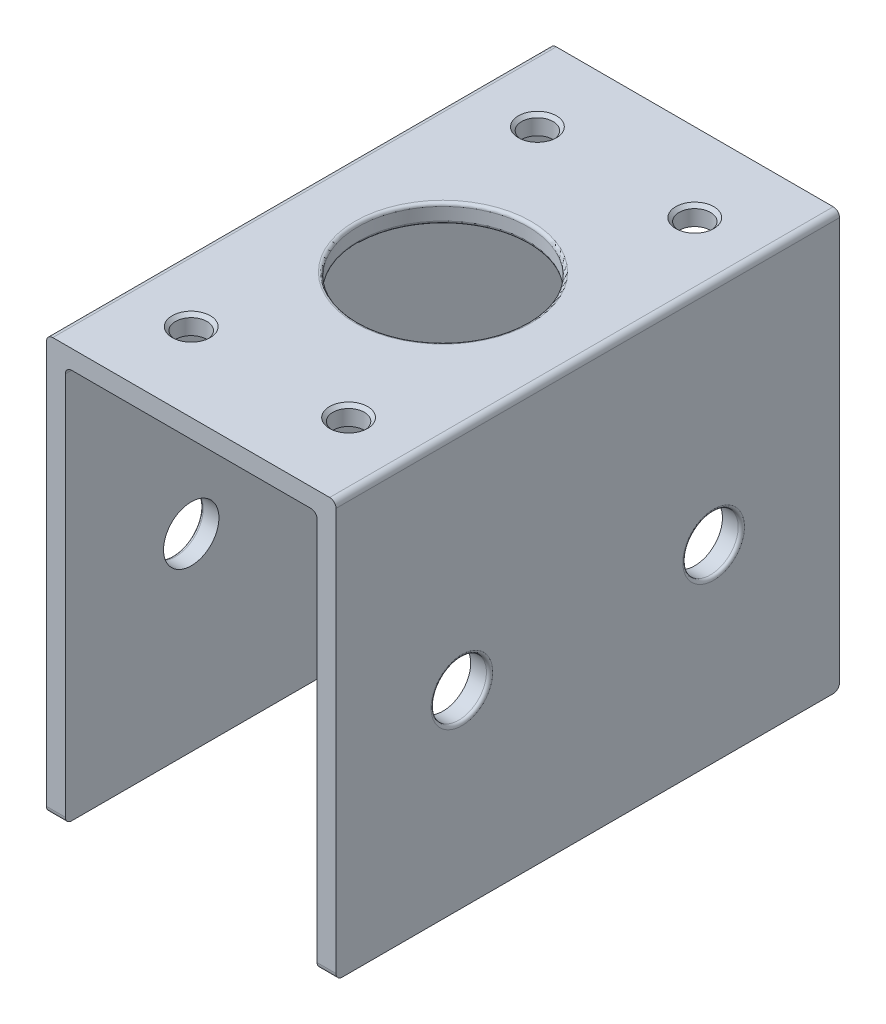
ISO-10303-21;
HEADER;
FILE_DESCRIPTION(('STEP AP214'),'2;1');
FILE_NAME('part.step','',(''),(''),'','','');
FILE_SCHEMA(('AUTOMOTIVE_DESIGN { 1 0 10303 214 1 1 1 1 }'));
ENDSEC;
DATA;
#1=APPLICATION_CONTEXT('core data for automotive mechanical design processes');
#2=APPLICATION_PROTOCOL_DEFINITION('international standard','automotive_design',2000,#1);
#3=PRODUCT_CONTEXT('',#1,'mechanical');
#4=PRODUCT('Part','Part','',(#3));
#5=PRODUCT_RELATED_PRODUCT_CATEGORY('part','',(#4));
#6=PRODUCT_DEFINITION_FORMATION('','',#4);
#7=PRODUCT_DEFINITION_CONTEXT('part definition',#1,'design');
#8=PRODUCT_DEFINITION('design','',#6,#7);
#9=PRODUCT_DEFINITION_SHAPE('','',#8);
#10=(LENGTH_UNIT() NAMED_UNIT(*) SI_UNIT(.MILLI.,.METRE.));
#11=(NAMED_UNIT(*) PLANE_ANGLE_UNIT() SI_UNIT($,.RADIAN.));
#12=(NAMED_UNIT(*) SI_UNIT($,.STERADIAN.) SOLID_ANGLE_UNIT());
#13=UNCERTAINTY_MEASURE_WITH_UNIT(LENGTH_MEASURE(1.E-05),#10,'distance_accuracy_value','');
#14=(GEOMETRIC_REPRESENTATION_CONTEXT(3) GLOBAL_UNCERTAINTY_ASSIGNED_CONTEXT((#13)) GLOBAL_UNIT_ASSIGNED_CONTEXT((#10,
#11,#12)) REPRESENTATION_CONTEXT('',''));
#15=CARTESIAN_POINT('',(0.,0.,0.));
#16=DIRECTION('',(0.,0.,1.));
#17=DIRECTION('',(1.,0.,0.));
#18=AXIS2_PLACEMENT_3D('',#15,#16,#17);
#19=CARTESIAN_POINT('',(0.,-63.,80.));
#20=DIRECTION('',(-1.,0.,0.));
#21=DIRECTION('',(0.,0.,1.));
#22=AXIS2_PLACEMENT_3D('',#19,#20,#21);
#23=PLANE('',#22);
#24=CARTESIAN_POINT('',(0.,-32.9999999999999,20.));
#25=DIRECTION('',(-1.,0.,0.));
#26=DIRECTION('',(0.,0.,1.));
#27=AXIS2_PLACEMENT_3D('',#24,#25,#26);
#28=CIRCLE('',#27,4.4);
#29=CARTESIAN_POINT('',(0.,-32.9999999999999,24.4));
#30=VERTEX_POINT('',#29);
#31=EDGE_CURVE('E931',#30,#30,#28,.T.);
#32=ORIENTED_EDGE('',*,*,#31,.T.);
#33=EDGE_LOOP('',(#32));
#34=FACE_BOUND('',#33,.T.);
#35=DIRECTION('',(0.,0.,-1.));
#36=VECTOR('',#35,1.);
#37=CARTESIAN_POINT('',(0.,-63.,80.));
#38=LINE('',#37,#36);
#39=CARTESIAN_POINT('',(0.,-63.,79.));
#40=VERTEX_POINT('',#39);
#41=CARTESIAN_POINT('',(0.,-63.,1.));
#42=VERTEX_POINT('',#41);
#43=EDGE_CURVE('E414',#40,#42,#38,.T.);
#44=ORIENTED_EDGE('',*,*,#43,.T.);
#45=CARTESIAN_POINT('',(0.,-62.,1.));
#46=DIRECTION('',(-1.,0.,0.));
#47=DIRECTION('',(0.,0.,1.));
#48=AXIS2_PLACEMENT_3D('',#45,#46,#47);
#49=CIRCLE('',#48,1.);
#50=CARTESIAN_POINT('',(0.,-62.,0.));
#51=VERTEX_POINT('',#50);
#52=EDGE_CURVE('E248',#42,#51,#49,.F.);
#53=ORIENTED_EDGE('',*,*,#52,.T.);
#54=DIRECTION('',(0.,1.,0.));
#55=VECTOR('',#54,1.);
#56=CARTESIAN_POINT('',(0.,-63.,0.));
#57=LINE('',#56,#55);
#58=CARTESIAN_POINT('',(0.,-1.,0.));
#59=VERTEX_POINT('',#58);
#60=EDGE_CURVE('E381',#51,#59,#57,.T.);
#61=ORIENTED_EDGE('',*,*,#60,.T.);
#62=DIRECTION('',(0.,0.,-1.));
#63=VECTOR('',#62,1.);
#64=CARTESIAN_POINT('',(0.,-1.,80.));
#65=LINE('',#64,#63);
#66=CARTESIAN_POINT('',(0.,-1.,80.));
#67=VERTEX_POINT('',#66);
#68=EDGE_CURVE('E245',#59,#67,#65,.F.);
#69=ORIENTED_EDGE('',*,*,#68,.T.);
#70=DIRECTION('',(0.,1.,0.));
#71=VECTOR('',#70,1.);
#72=CARTESIAN_POINT('',(0.,-63.,80.));
#73=LINE('',#72,#71);
#74=CARTESIAN_POINT('',(0.,-62.,80.));
#75=VERTEX_POINT('',#74);
#76=EDGE_CURVE('E405',#75,#67,#73,.T.);
#77=ORIENTED_EDGE('',*,*,#76,.F.);
#78=CARTESIAN_POINT('',(0.,-62.,79.));
#79=DIRECTION('',(-1.,0.,0.));
#80=DIRECTION('',(0.,0.,1.));
#81=AXIS2_PLACEMENT_3D('',#78,#79,#80);
#82=CIRCLE('',#81,1.);
#83=EDGE_CURVE('E242',#75,#40,#82,.F.);
#84=ORIENTED_EDGE('',*,*,#83,.T.);
#85=EDGE_LOOP('',(#44,#53,#61,#69,#77,#84));
#86=FACE_BOUND('',#85,.T.);
#87=CARTESIAN_POINT('',(0.,-32.9999999999999,60.));
#88=DIRECTION('',(-1.,0.,0.));
#89=DIRECTION('',(0.,0.,1.));
#90=AXIS2_PLACEMENT_3D('',#87,#88,#89);
#91=CIRCLE('',#90,4.4);
#92=CARTESIAN_POINT('',(0.,-32.9999999999999,64.4));
#93=VERTEX_POINT('',#92);
#94=EDGE_CURVE('E918',#93,#93,#91,.F.);
#95=ORIENTED_EDGE('',*,*,#94,.F.);
#96=EDGE_LOOP('',(#95));
#97=FACE_BOUND('',#96,.T.);
#98=ADVANCED_FACE('F55',(#34,#86,#97),#23,.F.);
#99=CARTESIAN_POINT('',(40.,0.,80.));
#100=DIRECTION('',(1.,0.,0.));
#101=DIRECTION('',(0.,1.,0.));
#102=AXIS2_PLACEMENT_3D('',#99,#100,#101);
#103=PLANE('',#102);
#104=CARTESIAN_POINT('',(40.,-32.9999999999999,20.));
#105=DIRECTION('',(1.,0.,0.));
#106=DIRECTION('',(0.,1.,0.));
#107=AXIS2_PLACEMENT_3D('',#104,#105,#106);
#108=CIRCLE('',#107,4.4);
#109=CARTESIAN_POINT('',(40.,-28.5999999999999,20.));
#110=VERTEX_POINT('',#109);
#111=EDGE_CURVE('E934',#110,#110,#108,.T.);
#112=ORIENTED_EDGE('',*,*,#111,.T.);
#113=EDGE_LOOP('',(#112));
#114=FACE_BOUND('',#113,.T.);
#115=DIRECTION('',(0.,-1.,0.));
#116=VECTOR('',#115,1.);
#117=CARTESIAN_POINT('',(40.,0.,0.));
#118=LINE('',#117,#116);
#119=CARTESIAN_POINT('',(40.,-1.,0.));
#120=VERTEX_POINT('',#119);
#121=CARTESIAN_POINT('',(40.,-62.,0.));
#122=VERTEX_POINT('',#121);
#123=EDGE_CURVE('E380',#120,#122,#118,.T.);
#124=ORIENTED_EDGE('',*,*,#123,.T.);
#125=CARTESIAN_POINT('',(40.,-62.,1.));
#126=DIRECTION('',(1.,0.,0.));
#127=DIRECTION('',(0.,1.,0.));
#128=AXIS2_PLACEMENT_3D('',#125,#126,#127);
#129=CIRCLE('',#128,1.);
#130=CARTESIAN_POINT('',(40.,-63.,1.));
#131=VERTEX_POINT('',#130);
#132=EDGE_CURVE('E232',#122,#131,#129,.F.);
#133=ORIENTED_EDGE('',*,*,#132,.T.);
#134=DIRECTION('',(0.,0.,-1.));
#135=VECTOR('',#134,1.);
#136=CARTESIAN_POINT('',(40.,-63.,80.));
#137=LINE('',#136,#135);
#138=CARTESIAN_POINT('',(40.,-63.,79.));
#139=VERTEX_POINT('',#138);
#140=EDGE_CURVE('E193',#139,#131,#137,.T.);
#141=ORIENTED_EDGE('',*,*,#140,.F.);
#142=CARTESIAN_POINT('',(40.,-62.,79.));
#143=DIRECTION('',(1.,0.,0.));
#144=DIRECTION('',(0.,1.,0.));
#145=AXIS2_PLACEMENT_3D('',#142,#143,#144);
#146=CIRCLE('',#145,1.);
#147=CARTESIAN_POINT('',(40.,-62.,80.));
#148=VERTEX_POINT('',#147);
#149=EDGE_CURVE('E198',#139,#148,#146,.F.);
#150=ORIENTED_EDGE('',*,*,#149,.T.);
#151=DIRECTION('',(0.,-1.,0.));
#152=VECTOR('',#151,1.);
#153=CARTESIAN_POINT('',(40.,0.,80.));
#154=LINE('',#153,#152);
#155=CARTESIAN_POINT('',(40.,-1.,80.));
#156=VERTEX_POINT('',#155);
#157=EDGE_CURVE('E391',#156,#148,#154,.T.);
#158=ORIENTED_EDGE('',*,*,#157,.F.);
#159=DIRECTION('',(0.,0.,-1.));
#160=VECTOR('',#159,1.);
#161=CARTESIAN_POINT('',(40.,-1.,0.));
#162=LINE('',#161,#160);
#163=EDGE_CURVE('E228',#156,#120,#162,.T.);
#164=ORIENTED_EDGE('',*,*,#163,.T.);
#165=EDGE_LOOP('',(#124,#133,#141,#150,#158,#164));
#166=FACE_BOUND('',#165,.T.);
#167=CARTESIAN_POINT('',(40.,-32.9999999999999,60.));
#168=DIRECTION('',(1.,0.,0.));
#169=DIRECTION('',(0.,1.,0.));
#170=AXIS2_PLACEMENT_3D('',#167,#168,#169);
#171=CIRCLE('',#170,4.4);
#172=CARTESIAN_POINT('',(40.,-28.5999999999999,60.));
#173=VERTEX_POINT('',#172);
#174=EDGE_CURVE('E925',#173,#173,#171,.F.);
#175=ORIENTED_EDGE('',*,*,#174,.F.);
#176=EDGE_LOOP('',(#175));
#177=FACE_BOUND('',#176,.T.);
#178=ADVANCED_FACE('F395',(#114,#166,#177),#103,.F.);
#179=CARTESIAN_POINT('',(43.,-63.,80.));
#180=DIRECTION('',(-1.,0.,0.));
#181=DIRECTION('',(0.,0.,1.));
#182=AXIS2_PLACEMENT_3D('',#179,#180,#181);
#183=PLANE('',#182);
#184=CARTESIAN_POINT('',(43.,-32.9999999999999,20.));
#185=DIRECTION('',(-1.,0.,0.));
#186=DIRECTION('',(0.,0.,1.));
#187=AXIS2_PLACEMENT_3D('',#184,#185,#186);
#188=CIRCLE('',#187,4.9);
#189=CARTESIAN_POINT('',(43.,-32.9999999999999,24.9));
#190=VERTEX_POINT('',#189);
#191=EDGE_CURVE('E306',#190,#190,#188,.T.);
#192=ORIENTED_EDGE('',*,*,#191,.T.);
#193=EDGE_LOOP('',(#192));
#194=FACE_BOUND('',#193,.T.);
#195=CARTESIAN_POINT('',(43.,-32.9999999999999,60.));
#196=DIRECTION('',(-1.,0.,0.));
#197=DIRECTION('',(0.,0.,1.));
#198=AXIS2_PLACEMENT_3D('',#195,#196,#197);
#199=CIRCLE('',#198,4.9);
#200=CARTESIAN_POINT('',(43.,-32.9999999999999,64.9));
#201=VERTEX_POINT('',#200);
#202=EDGE_CURVE('E302',#201,#201,#199,.T.);
#203=ORIENTED_EDGE('',*,*,#202,.T.);
#204=EDGE_LOOP('',(#203));
#205=FACE_BOUND('',#204,.T.);
#206=DIRECTION('',(0.,0.,-1.));
#207=VECTOR('',#206,1.);
#208=CARTESIAN_POINT('',(43.,-63.,80.));
#209=LINE('',#208,#207);
#210=CARTESIAN_POINT('',(43.,-63.,79.));
#211=VERTEX_POINT('',#210);
#212=CARTESIAN_POINT('',(43.,-63.,1.));
#213=VERTEX_POINT('',#212);
#214=EDGE_CURVE('E174',#211,#213,#209,.T.);
#215=ORIENTED_EDGE('',*,*,#214,.T.);
#216=CARTESIAN_POINT('',(43.,-62.,1.));
#217=DIRECTION('',(-1.,0.,0.));
#218=DIRECTION('',(0.,0.,1.));
#219=AXIS2_PLACEMENT_3D('',#216,#217,#218);
#220=CIRCLE('',#219,1.);
#221=CARTESIAN_POINT('',(43.,-62.,0.));
#222=VERTEX_POINT('',#221);
#223=EDGE_CURVE('E181',#213,#222,#220,.F.);
#224=ORIENTED_EDGE('',*,*,#223,.T.);
#225=DIRECTION('',(0.,1.,0.));
#226=VECTOR('',#225,1.);
#227=CARTESIAN_POINT('',(43.,-63.,0.));
#228=LINE('',#227,#226);
#229=CARTESIAN_POINT('',(43.,2.,0.));
#230=VERTEX_POINT('',#229);
#231=EDGE_CURVE('E420',#222,#230,#228,.T.);
#232=ORIENTED_EDGE('',*,*,#231,.T.);
#233=DIRECTION('',(0.,0.,-1.));
#234=VECTOR('',#233,1.);
#235=CARTESIAN_POINT('',(43.,2.,80.));
#236=LINE('',#235,#234);
#237=CARTESIAN_POINT('',(43.,2.,80.));
#238=VERTEX_POINT('',#237);
#239=EDGE_CURVE('E182',#230,#238,#236,.F.);
#240=ORIENTED_EDGE('',*,*,#239,.T.);
#241=DIRECTION('',(0.,1.,0.));
#242=VECTOR('',#241,1.);
#243=CARTESIAN_POINT('',(43.,-63.,80.));
#244=LINE('',#243,#242);
#245=CARTESIAN_POINT('',(43.,-62.,80.));
#246=VERTEX_POINT('',#245);
#247=EDGE_CURVE('E175',#246,#238,#244,.T.);
#248=ORIENTED_EDGE('',*,*,#247,.F.);
#249=CARTESIAN_POINT('',(43.,-62.,79.));
#250=DIRECTION('',(-1.,0.,0.));
#251=DIRECTION('',(0.,0.,1.));
#252=AXIS2_PLACEMENT_3D('',#249,#250,#251);
#253=CIRCLE('',#252,1.);
#254=EDGE_CURVE('E171',#246,#211,#253,.F.);
#255=ORIENTED_EDGE('',*,*,#254,.T.);
#256=EDGE_LOOP('',(#215,#224,#232,#240,#248,#255));
#257=FACE_BOUND('',#256,.T.);
#258=ADVANCED_FACE('F173',(#194,#205,#257),#183,.F.);
#259=CARTESIAN_POINT('',(-3.,2.99999999999999,80.));
#260=DIRECTION('',(1.,0.,0.));
#261=DIRECTION('',(0.,1.,0.));
#262=AXIS2_PLACEMENT_3D('',#259,#260,#261);
#263=PLANE('',#262);
#264=CARTESIAN_POINT('',(-3.,-32.9999999999999,60.));
#265=DIRECTION('',(1.,0.,0.));
#266=DIRECTION('',(0.,1.,0.));
#267=AXIS2_PLACEMENT_3D('',#264,#265,#266);
#268=CIRCLE('',#267,4.9);
#269=CARTESIAN_POINT('',(-3.,-28.0999999999999,60.));
#270=VERTEX_POINT('',#269);
#271=EDGE_CURVE('E322',#270,#270,#268,.T.);
#272=ORIENTED_EDGE('',*,*,#271,.T.);
#273=EDGE_LOOP('',(#272));
#274=FACE_BOUND('',#273,.T.);
#275=CARTESIAN_POINT('',(-3.,-32.9999999999999,20.));
#276=DIRECTION('',(1.,0.,0.));
#277=DIRECTION('',(0.,1.,0.));
#278=AXIS2_PLACEMENT_3D('',#275,#276,#277);
#279=CIRCLE('',#278,4.9);
#280=CARTESIAN_POINT('',(-3.,-28.0999999999999,20.));
#281=VERTEX_POINT('',#280);
#282=EDGE_CURVE('E318',#281,#281,#279,.T.);
#283=ORIENTED_EDGE('',*,*,#282,.T.);
#284=EDGE_LOOP('',(#283));
#285=FACE_BOUND('',#284,.T.);
#286=DIRECTION('',(0.,-1.,0.));
#287=VECTOR('',#286,1.);
#288=CARTESIAN_POINT('',(-3.,2.99999999999999,0.));
#289=LINE('',#288,#287);
#290=CARTESIAN_POINT('',(-3.,1.99999999999999,0.));
#291=VERTEX_POINT('',#290);
#292=CARTESIAN_POINT('',(-3.,-62.,0.));
#293=VERTEX_POINT('',#292);
#294=EDGE_CURVE('E427',#291,#293,#289,.T.);
#295=ORIENTED_EDGE('',*,*,#294,.T.);
#296=CARTESIAN_POINT('',(-3.,-62.,1.));
#297=DIRECTION('',(1.,0.,0.));
#298=DIRECTION('',(0.,1.,0.));
#299=AXIS2_PLACEMENT_3D('',#296,#297,#298);
#300=CIRCLE('',#299,1.);
#301=CARTESIAN_POINT('',(-3.,-63.,1.));
#302=VERTEX_POINT('',#301);
#303=EDGE_CURVE('E258',#293,#302,#300,.F.);
#304=ORIENTED_EDGE('',*,*,#303,.T.);
#305=DIRECTION('',(0.,0.,-1.));
#306=VECTOR('',#305,1.);
#307=CARTESIAN_POINT('',(-3.,-63.,80.));
#308=LINE('',#307,#306);
#309=CARTESIAN_POINT('',(-3.,-63.,79.));
#310=VERTEX_POINT('',#309);
#311=EDGE_CURVE('E194',#310,#302,#308,.T.);
#312=ORIENTED_EDGE('',*,*,#311,.F.);
#313=CARTESIAN_POINT('',(-3.,-62.,79.));
#314=DIRECTION('',(1.,0.,0.));
#315=DIRECTION('',(0.,1.,0.));
#316=AXIS2_PLACEMENT_3D('',#313,#314,#315);
#317=CIRCLE('',#316,1.);
#318=CARTESIAN_POINT('',(-3.,-62.,80.));
#319=VERTEX_POINT('',#318);
#320=EDGE_CURVE('E255',#310,#319,#317,.F.);
#321=ORIENTED_EDGE('',*,*,#320,.T.);
#322=DIRECTION('',(0.,-1.,0.));
#323=VECTOR('',#322,1.);
#324=CARTESIAN_POINT('',(-3.,2.99999999999999,80.));
#325=LINE('',#324,#323);
#326=CARTESIAN_POINT('',(-3.,1.99999999999999,80.));
#327=VERTEX_POINT('',#326);
#328=EDGE_CURVE('E411',#327,#319,#325,.T.);
#329=ORIENTED_EDGE('',*,*,#328,.F.);
#330=DIRECTION('',(0.,0.,-1.));
#331=VECTOR('',#330,1.);
#332=CARTESIAN_POINT('',(-3.,1.99999999999999,80.));
#333=LINE('',#332,#331);
#334=EDGE_CURVE('E251',#327,#291,#333,.T.);
#335=ORIENTED_EDGE('',*,*,#334,.T.);
#336=EDGE_LOOP('',(#295,#304,#312,#321,#329,#335));
#337=FACE_BOUND('',#336,.T.);
#338=ADVANCED_FACE('F354',(#274,#285,#337),#263,.F.);
#339=CARTESIAN_POINT('',(0.,0.,80.));
#340=DIRECTION('',(0.,1.,0.));
#341=DIRECTION('',(0.,0.,1.));
#342=AXIS2_PLACEMENT_3D('',#339,#340,#341);
#343=PLANE('',#342);
#344=CARTESIAN_POINT('',(20.,0.,40.));
#345=DIRECTION('',(0.,1.,0.));
#346=DIRECTION('',(0.,0.,1.));
#347=AXIS2_PLACEMENT_3D('',#344,#345,#346);
#348=CIRCLE('',#347,14.);
#349=CARTESIAN_POINT('',(20.,0.,54.));
#350=VERTEX_POINT('',#349);
#351=EDGE_CURVE('E330',#350,#350,#348,.T.);
#352=ORIENTED_EDGE('',*,*,#351,.T.);
#353=EDGE_LOOP('',(#352));
#354=FACE_BOUND('',#353,.T.);
#355=CARTESIAN_POINT('',(7.5,0.,12.5));
#356=DIRECTION('',(0.,1.,0.));
#357=DIRECTION('',(0.,0.,1.));
#358=AXIS2_PLACEMENT_3D('',#355,#356,#357);
#359=CIRCLE('',#358,2.49999999999999);
#360=CARTESIAN_POINT('',(7.5,0.,15.));
#361=VERTEX_POINT('',#360);
#362=EDGE_CURVE('E207',#361,#361,#359,.T.);
#363=ORIENTED_EDGE('',*,*,#362,.T.);
#364=EDGE_LOOP('',(#363));
#365=FACE_BOUND('',#364,.T.);
#366=CARTESIAN_POINT('',(32.5,0.,12.5));
#367=DIRECTION('',(0.,1.,0.));
#368=DIRECTION('',(0.,0.,1.));
#369=AXIS2_PLACEMENT_3D('',#366,#367,#368);
#370=CIRCLE('',#369,2.49999999999999);
#371=CARTESIAN_POINT('',(32.5,0.,15.));
#372=VERTEX_POINT('',#371);
#373=EDGE_CURVE('E362',#372,#372,#370,.T.);
#374=ORIENTED_EDGE('',*,*,#373,.T.);
#375=EDGE_LOOP('',(#374));
#376=FACE_BOUND('',#375,.T.);
#377=CARTESIAN_POINT('',(32.5,0.,67.5));
#378=DIRECTION('',(0.,1.,0.));
#379=DIRECTION('',(0.,0.,1.));
#380=AXIS2_PLACEMENT_3D('',#377,#378,#379);
#381=CIRCLE('',#380,2.49999999999999);
#382=CARTESIAN_POINT('',(32.5,0.,70.));
#383=VERTEX_POINT('',#382);
#384=EDGE_CURVE('E366',#383,#383,#381,.T.);
#385=ORIENTED_EDGE('',*,*,#384,.T.);
#386=EDGE_LOOP('',(#385));
#387=FACE_BOUND('',#386,.T.);
#388=CARTESIAN_POINT('',(7.50000000000001,0.,67.5));
#389=DIRECTION('',(0.,1.,0.));
#390=DIRECTION('',(0.,0.,1.));
#391=AXIS2_PLACEMENT_3D('',#388,#389,#390);
#392=CIRCLE('',#391,2.49999999999999);
#393=CARTESIAN_POINT('',(7.50000000000001,0.,70.));
#394=VERTEX_POINT('',#393);
#395=EDGE_CURVE('E370',#394,#394,#392,.T.);
#396=ORIENTED_EDGE('',*,*,#395,.T.);
#397=EDGE_LOOP('',(#396));
#398=FACE_BOUND('',#397,.T.);
#399=DIRECTION('',(1.,0.,0.));
#400=VECTOR('',#399,1.);
#401=CARTESIAN_POINT('',(0.,0.,0.));
#402=LINE('',#401,#400);
#403=CARTESIAN_POINT('',(1.,0.,0.));
#404=VERTEX_POINT('',#403);
#405=CARTESIAN_POINT('',(39.,0.,0.));
#406=VERTEX_POINT('',#405);
#407=EDGE_CURVE('E373',#404,#406,#402,.T.);
#408=ORIENTED_EDGE('',*,*,#407,.T.);
#409=DIRECTION('',(0.,0.,-1.));
#410=VECTOR('',#409,1.);
#411=CARTESIAN_POINT('',(39.,0.,80.));
#412=LINE('',#411,#410);
#413=CARTESIAN_POINT('',(39.,0.,80.));
#414=VERTEX_POINT('',#413);
#415=EDGE_CURVE('E265',#406,#414,#412,.F.);
#416=ORIENTED_EDGE('',*,*,#415,.T.);
#417=DIRECTION('',(1.,0.,0.));
#418=VECTOR('',#417,1.);
#419=CARTESIAN_POINT('',(0.,0.,80.));
#420=LINE('',#419,#418);
#421=CARTESIAN_POINT('',(1.,0.,80.));
#422=VERTEX_POINT('',#421);
#423=EDGE_CURVE('E392',#422,#414,#420,.T.);
#424=ORIENTED_EDGE('',*,*,#423,.F.);
#425=DIRECTION('',(0.,0.,-1.));
#426=VECTOR('',#425,1.);
#427=CARTESIAN_POINT('',(1.,0.,0.));
#428=LINE('',#427,#426);
#429=EDGE_CURVE('E261',#422,#404,#428,.T.);
#430=ORIENTED_EDGE('',*,*,#429,.T.);
#431=EDGE_LOOP('',(#408,#416,#424,#430));
#432=FACE_BOUND('',#431,.T.);
#433=ADVANCED_FACE('F351',(#354,#365,#376,#387,#398,#432),#343,.F.);
#434=CARTESIAN_POINT('',(40.,-63.,80.));
#435=DIRECTION('',(0.,1.,0.));
#436=DIRECTION('',(0.,0.,1.));
#437=AXIS2_PLACEMENT_3D('',#434,#435,#436);
#438=PLANE('',#437);
#439=ORIENTED_EDGE('',*,*,#140,.T.);
#440=DIRECTION('',(1.,0.,0.));
#441=VECTOR('',#440,1.);
#442=CARTESIAN_POINT('',(43.,-63.,1.));
#443=LINE('',#442,#441);
#444=EDGE_CURVE('E191',#131,#213,#443,.T.);
#445=ORIENTED_EDGE('',*,*,#444,.T.);
#446=ORIENTED_EDGE('',*,*,#214,.F.);
#447=DIRECTION('',(1.,0.,0.));
#448=VECTOR('',#447,1.);
#449=CARTESIAN_POINT('',(40.,-63.,79.));
#450=LINE('',#449,#448);
#451=EDGE_CURVE('E188',#211,#139,#450,.F.);
#452=ORIENTED_EDGE('',*,*,#451,.T.);
#453=EDGE_LOOP('',(#439,#445,#446,#452));
#454=FACE_BOUND('',#453,.T.);
#455=ADVANCED_FACE('F187',(#454),#438,.F.);
#456=CARTESIAN_POINT('',(43.,3.,80.));
#457=DIRECTION('',(0.,-1.,0.));
#458=DIRECTION('',(1.,0.,0.));
#459=AXIS2_PLACEMENT_3D('',#456,#457,#458);
#460=PLANE('',#459);
#461=CARTESIAN_POINT('',(20.,3.,40.));
#462=DIRECTION('',(0.,-1.,0.));
#463=DIRECTION('',(1.,0.,0.));
#464=AXIS2_PLACEMENT_3D('',#461,#462,#463);
#465=CIRCLE('',#464,14.);
#466=CARTESIAN_POINT('',(34.,3.,40.));
#467=VERTEX_POINT('',#466);
#468=EDGE_CURVE('E11',#467,#467,#465,.T.);
#469=ORIENTED_EDGE('',*,*,#468,.T.);
#470=EDGE_LOOP('',(#469));
#471=FACE_BOUND('',#470,.T.);
#472=CARTESIAN_POINT('',(7.5,3.,12.5));
#473=DIRECTION('',(0.,1.,0.));
#474=DIRECTION('',(0.,0.,1.));
#475=AXIS2_PLACEMENT_3D('',#472,#473,#474);
#476=CIRCLE('',#475,3.025);
#477=CARTESIAN_POINT('',(7.5,3.,15.525));
#478=VERTEX_POINT('',#477);
#479=EDGE_CURVE('E898',#478,#478,#476,.T.);
#480=ORIENTED_EDGE('',*,*,#479,.F.);
#481=EDGE_LOOP('',(#480));
#482=FACE_BOUND('',#481,.T.);
#483=CARTESIAN_POINT('',(32.5,3.,12.5));
#484=DIRECTION('',(0.,1.,0.));
#485=DIRECTION('',(0.,0.,1.));
#486=AXIS2_PLACEMENT_3D('',#483,#484,#485);
#487=CIRCLE('',#486,3.025);
#488=CARTESIAN_POINT('',(32.5,3.,15.525));
#489=VERTEX_POINT('',#488);
#490=EDGE_CURVE('E452',#489,#489,#487,.T.);
#491=ORIENTED_EDGE('',*,*,#490,.F.);
#492=EDGE_LOOP('',(#491));
#493=FACE_BOUND('',#492,.T.);
#494=CARTESIAN_POINT('',(32.5,3.,67.5));
#495=DIRECTION('',(0.,1.,0.));
#496=DIRECTION('',(0.,0.,1.));
#497=AXIS2_PLACEMENT_3D('',#494,#495,#496);
#498=CIRCLE('',#497,3.025);
#499=CARTESIAN_POINT('',(32.5,3.,70.525));
#500=VERTEX_POINT('',#499);
#501=EDGE_CURVE('E444',#500,#500,#498,.T.);
#502=ORIENTED_EDGE('',*,*,#501,.F.);
#503=EDGE_LOOP('',(#502));
#504=FACE_BOUND('',#503,.T.);
#505=CARTESIAN_POINT('',(7.50000000000001,3.,67.5));
#506=DIRECTION('',(0.,1.,0.));
#507=DIRECTION('',(0.,0.,1.));
#508=AXIS2_PLACEMENT_3D('',#505,#506,#507);
#509=CIRCLE('',#508,3.025);
#510=CARTESIAN_POINT('',(7.50000000000001,3.,70.525));
#511=VERTEX_POINT('',#510);
#512=EDGE_CURVE('E441',#511,#511,#509,.T.);
#513=ORIENTED_EDGE('',*,*,#512,.F.);
#514=EDGE_LOOP('',(#513));
#515=FACE_BOUND('',#514,.T.);
#516=DIRECTION('',(-1.,0.,0.));
#517=VECTOR('',#516,1.);
#518=CARTESIAN_POINT('',(43.,3.,80.));
#519=LINE('',#518,#517);
#520=CARTESIAN_POINT('',(42.,3.,80.));
#521=VERTEX_POINT('',#520);
#522=CARTESIAN_POINT('',(-2.,2.99999999999999,80.));
#523=VERTEX_POINT('',#522);
#524=EDGE_CURVE('E403',#521,#523,#519,.T.);
#525=ORIENTED_EDGE('',*,*,#524,.F.);
#526=DIRECTION('',(0.,0.,-1.));
#527=VECTOR('',#526,1.);
#528=CARTESIAN_POINT('',(42.,3.,80.));
#529=LINE('',#528,#527);
#530=CARTESIAN_POINT('',(42.,3.,0.));
#531=VERTEX_POINT('',#530);
#532=EDGE_CURVE('E282',#521,#531,#529,.T.);
#533=ORIENTED_EDGE('',*,*,#532,.T.);
#534=DIRECTION('',(-1.,0.,0.));
#535=VECTOR('',#534,1.);
#536=CARTESIAN_POINT('',(43.,3.,0.));
#537=LINE('',#536,#535);
#538=CARTESIAN_POINT('',(-2.,2.99999999999999,0.));
#539=VERTEX_POINT('',#538);
#540=EDGE_CURVE('E424',#531,#539,#537,.T.);
#541=ORIENTED_EDGE('',*,*,#540,.T.);
#542=DIRECTION('',(0.,0.,-1.));
#543=VECTOR('',#542,1.);
#544=CARTESIAN_POINT('',(-2.,2.99999999999999,80.));
#545=LINE('',#544,#543);
#546=EDGE_CURVE('E71',#539,#523,#545,.F.);
#547=ORIENTED_EDGE('',*,*,#546,.T.);
#548=EDGE_LOOP('',(#525,#533,#541,#547));
#549=FACE_BOUND('',#548,.T.);
#550=ADVANCED_FACE('F823',(#471,#482,#493,#504,#515,#549),#460,.F.);
#551=CARTESIAN_POINT('',(-3.,-63.,80.));
#552=DIRECTION('',(0.,1.,0.));
#553=DIRECTION('',(0.,0.,1.));
#554=AXIS2_PLACEMENT_3D('',#551,#552,#553);
#555=PLANE('',#554);
#556=ORIENTED_EDGE('',*,*,#311,.T.);
#557=DIRECTION('',(1.,0.,0.));
#558=VECTOR('',#557,1.);
#559=CARTESIAN_POINT('',(0.,-63.,1.));
#560=LINE('',#559,#558);
#561=EDGE_CURVE('E238',#302,#42,#560,.T.);
#562=ORIENTED_EDGE('',*,*,#561,.T.);
#563=ORIENTED_EDGE('',*,*,#43,.F.);
#564=DIRECTION('',(1.,0.,0.));
#565=VECTOR('',#564,1.);
#566=CARTESIAN_POINT('',(-3.,-63.,79.));
#567=LINE('',#566,#565);
#568=EDGE_CURVE('E235',#40,#310,#567,.F.);
#569=ORIENTED_EDGE('',*,*,#568,.T.);
#570=EDGE_LOOP('',(#556,#562,#563,#569));
#571=FACE_BOUND('',#570,.T.);
#572=ADVANCED_FACE('F491',(#571),#555,.F.);
#573=CARTESIAN_POINT('',(0.,0.,80.));
#574=DIRECTION('',(0.,0.,-1.));
#575=DIRECTION('',(-1.,0.,0.));
#576=AXIS2_PLACEMENT_3D('',#573,#574,#575);
#577=PLANE('',#576);
#578=ORIENTED_EDGE('',*,*,#328,.T.);
#579=DIRECTION('',(1.,0.,0.));
#580=VECTOR('',#579,1.);
#581=CARTESIAN_POINT('',(0.,-62.,80.));
#582=LINE('',#581,#580);
#583=EDGE_CURVE('E276',#319,#75,#582,.T.);
#584=ORIENTED_EDGE('',*,*,#583,.T.);
#585=ORIENTED_EDGE('',*,*,#76,.T.);
#586=CARTESIAN_POINT('',(1.,-1.,80.));
#587=DIRECTION('',(0.,0.,-1.));
#588=DIRECTION('',(-1.,0.,0.));
#589=AXIS2_PLACEMENT_3D('',#586,#587,#588);
#590=CIRCLE('',#589,1.);
#591=EDGE_CURVE('E295',#67,#422,#590,.T.);
#592=ORIENTED_EDGE('',*,*,#591,.T.);
#593=ORIENTED_EDGE('',*,*,#423,.T.);
#594=CARTESIAN_POINT('',(39.,-1.,80.));
#595=DIRECTION('',(0.,0.,-1.));
#596=DIRECTION('',(-1.,0.,0.));
#597=AXIS2_PLACEMENT_3D('',#594,#595,#596);
#598=CIRCLE('',#597,1.);
#599=EDGE_CURVE('E289',#414,#156,#598,.T.);
#600=ORIENTED_EDGE('',*,*,#599,.T.);
#601=ORIENTED_EDGE('',*,*,#157,.T.);
#602=DIRECTION('',(1.,0.,0.));
#603=VECTOR('',#602,1.);
#604=CARTESIAN_POINT('',(0.,-62.,80.));
#605=LINE('',#604,#603);
#606=EDGE_CURVE('E273',#148,#246,#605,.T.);
#607=ORIENTED_EDGE('',*,*,#606,.T.);
#608=ORIENTED_EDGE('',*,*,#247,.T.);
#609=CARTESIAN_POINT('',(42.,2.,80.));
#610=DIRECTION('',(0.,0.,-1.));
#611=DIRECTION('',(-1.,0.,0.));
#612=AXIS2_PLACEMENT_3D('',#609,#610,#611);
#613=CIRCLE('',#612,1.);
#614=EDGE_CURVE('E78',#238,#521,#613,.F.);
#615=ORIENTED_EDGE('',*,*,#614,.T.);
#616=ORIENTED_EDGE('',*,*,#524,.T.);
#617=CARTESIAN_POINT('',(-2.,1.99999999999999,80.));
#618=DIRECTION('',(0.,0.,-1.));
#619=DIRECTION('',(-1.,0.,0.));
#620=AXIS2_PLACEMENT_3D('',#617,#618,#619);
#621=CIRCLE('',#620,1.);
#622=EDGE_CURVE('E268',#523,#327,#621,.F.);
#623=ORIENTED_EDGE('',*,*,#622,.T.);
#624=EDGE_LOOP('',(#578,#584,#585,#592,#593,#600,#601,#607,#608,#615,#616,#623));
#625=FACE_BOUND('',#624,.T.);
#626=ADVANCED_FACE('F390',(#625),#577,.F.);
#627=CARTESIAN_POINT('',(0.,0.,0.));
#628=DIRECTION('',(0.,0.,-1.));
#629=DIRECTION('',(-1.,0.,0.));
#630=AXIS2_PLACEMENT_3D('',#627,#628,#629);
#631=PLANE('',#630);
#632=ORIENTED_EDGE('',*,*,#231,.F.);
#633=DIRECTION('',(1.,0.,0.));
#634=VECTOR('',#633,1.);
#635=CARTESIAN_POINT('',(40.,-62.,0.));
#636=LINE('',#635,#634);
#637=EDGE_CURVE('E223',#222,#122,#636,.F.);
#638=ORIENTED_EDGE('',*,*,#637,.T.);
#639=ORIENTED_EDGE('',*,*,#123,.F.);
#640=CARTESIAN_POINT('',(39.,-1.,0.));
#641=DIRECTION('',(0.,0.,-1.));
#642=DIRECTION('',(-1.,0.,0.));
#643=AXIS2_PLACEMENT_3D('',#640,#641,#642);
#644=CIRCLE('',#643,1.);
#645=EDGE_CURVE('E286',#120,#406,#644,.F.);
#646=ORIENTED_EDGE('',*,*,#645,.T.);
#647=ORIENTED_EDGE('',*,*,#407,.F.);
#648=CARTESIAN_POINT('',(1.,-1.,0.));
#649=DIRECTION('',(0.,0.,-1.));
#650=DIRECTION('',(-1.,0.,0.));
#651=AXIS2_PLACEMENT_3D('',#648,#649,#650);
#652=CIRCLE('',#651,1.);
#653=EDGE_CURVE('E292',#404,#59,#652,.F.);
#654=ORIENTED_EDGE('',*,*,#653,.T.);
#655=ORIENTED_EDGE('',*,*,#60,.F.);
#656=DIRECTION('',(1.,0.,0.));
#657=VECTOR('',#656,1.);
#658=CARTESIAN_POINT('',(-3.,-62.,0.));
#659=LINE('',#658,#657);
#660=EDGE_CURVE('E220',#51,#293,#659,.F.);
#661=ORIENTED_EDGE('',*,*,#660,.T.);
#662=ORIENTED_EDGE('',*,*,#294,.F.);
#663=CARTESIAN_POINT('',(-2.,1.99999999999999,0.));
#664=DIRECTION('',(0.,0.,-1.));
#665=DIRECTION('',(-1.,0.,0.));
#666=AXIS2_PLACEMENT_3D('',#663,#664,#665);
#667=CIRCLE('',#666,1.);
#668=EDGE_CURVE('E214',#291,#539,#667,.T.);
#669=ORIENTED_EDGE('',*,*,#668,.T.);
#670=ORIENTED_EDGE('',*,*,#540,.F.);
#671=CARTESIAN_POINT('',(42.,2.,0.));
#672=DIRECTION('',(0.,0.,-1.));
#673=DIRECTION('',(-1.,0.,0.));
#674=AXIS2_PLACEMENT_3D('',#671,#672,#673);
#675=CIRCLE('',#674,1.);
#676=EDGE_CURVE('E217',#531,#230,#675,.T.);
#677=ORIENTED_EDGE('',*,*,#676,.T.);
#678=EDGE_LOOP('',(#632,#638,#639,#646,#647,#654,#655,#661,#662,#669,#670,#677));
#679=FACE_BOUND('',#678,.T.);
#680=ADVANCED_FACE('F482',(#679),#631,.T.);
#681=CARTESIAN_POINT('',(7.50000000000001,3.,67.5));
#682=DIRECTION('',(0.,1.,0.));
#683=DIRECTION('',(0.,0.,1.));
#684=AXIS2_PLACEMENT_3D('',#681,#682,#683);
#685=CYLINDRICAL_SURFACE('',#684,2.49999999999999);
#686=CARTESIAN_POINT('',(7.50000000000001,2.47499999999997,67.5));
#687=DIRECTION('',(0.,1.,0.));
#688=DIRECTION('',(0.,0.,1.));
#689=AXIS2_PLACEMENT_3D('',#686,#687,#688);
#690=CIRCLE('',#689,2.49999999999999);
#691=CARTESIAN_POINT('',(7.50000000000001,2.47499999999997,70.));
#692=VERTEX_POINT('',#691);
#693=EDGE_CURVE('E439',#692,#692,#690,.T.);
#694=ORIENTED_EDGE('',*,*,#693,.T.);
#695=EDGE_LOOP('',(#694));
#696=FACE_BOUND('',#695,.T.);
#697=ORIENTED_EDGE('',*,*,#395,.F.);
#698=EDGE_LOOP('',(#697));
#699=FACE_BOUND('',#698,.T.);
#700=ADVANCED_FACE('F789',(#696,#699),#685,.F.);
#701=CARTESIAN_POINT('',(7.50000000000001,3.,67.5));
#702=DIRECTION('',(0.,1.,0.));
#703=DIRECTION('',(0.,0.,1.));
#704=AXIS2_PLACEMENT_3D('',#701,#702,#703);
#705=CONICAL_SURFACE('',#704,3.025,0.785398163397433);
#706=ORIENTED_EDGE('',*,*,#693,.F.);
#707=EDGE_LOOP('',(#706));
#708=FACE_BOUND('',#707,.T.);
#709=ORIENTED_EDGE('',*,*,#512,.T.);
#710=EDGE_LOOP('',(#709));
#711=FACE_BOUND('',#710,.T.);
#712=ADVANCED_FACE('F779',(#708,#711),#705,.F.);
#713=CARTESIAN_POINT('',(32.5,3.,67.5));
#714=DIRECTION('',(0.,1.,0.));
#715=DIRECTION('',(0.,0.,1.));
#716=AXIS2_PLACEMENT_3D('',#713,#714,#715);
#717=CYLINDRICAL_SURFACE('',#716,2.49999999999999);
#718=CARTESIAN_POINT('',(32.5,2.47499999999997,67.5));
#719=DIRECTION('',(0.,1.,0.));
#720=DIRECTION('',(0.,0.,1.));
#721=AXIS2_PLACEMENT_3D('',#718,#719,#720);
#722=CIRCLE('',#721,2.49999999999999);
#723=CARTESIAN_POINT('',(32.5,2.47499999999997,70.));
#724=VERTEX_POINT('',#723);
#725=EDGE_CURVE('E442',#724,#724,#722,.T.);
#726=ORIENTED_EDGE('',*,*,#725,.T.);
#727=EDGE_LOOP('',(#726));
#728=FACE_BOUND('',#727,.T.);
#729=ORIENTED_EDGE('',*,*,#384,.F.);
#730=EDGE_LOOP('',(#729));
#731=FACE_BOUND('',#730,.T.);
#732=ADVANCED_FACE('F769',(#728,#731),#717,.F.);
#733=CARTESIAN_POINT('',(32.5,3.,67.5));
#734=DIRECTION('',(0.,1.,0.));
#735=DIRECTION('',(0.,0.,1.));
#736=AXIS2_PLACEMENT_3D('',#733,#734,#735);
#737=CONICAL_SURFACE('',#736,3.025,0.785398163397433);
#738=ORIENTED_EDGE('',*,*,#725,.F.);
#739=EDGE_LOOP('',(#738));
#740=FACE_BOUND('',#739,.T.);
#741=ORIENTED_EDGE('',*,*,#501,.T.);
#742=EDGE_LOOP('',(#741));
#743=FACE_BOUND('',#742,.T.);
#744=ADVANCED_FACE('F760',(#740,#743),#737,.F.);
#745=CARTESIAN_POINT('',(32.5,3.,12.5));
#746=DIRECTION('',(0.,1.,0.));
#747=DIRECTION('',(0.,0.,1.));
#748=AXIS2_PLACEMENT_3D('',#745,#746,#747);
#749=CYLINDRICAL_SURFACE('',#748,2.49999999999999);
#750=CARTESIAN_POINT('',(32.5,2.47499999999997,12.5));
#751=DIRECTION('',(0.,1.,0.));
#752=DIRECTION('',(0.,0.,1.));
#753=AXIS2_PLACEMENT_3D('',#750,#751,#752);
#754=CIRCLE('',#753,2.49999999999999);
#755=CARTESIAN_POINT('',(32.5,2.47499999999997,15.));
#756=VERTEX_POINT('',#755);
#757=EDGE_CURVE('E445',#756,#756,#754,.T.);
#758=ORIENTED_EDGE('',*,*,#757,.T.);
#759=EDGE_LOOP('',(#758));
#760=FACE_BOUND('',#759,.T.);
#761=ORIENTED_EDGE('',*,*,#373,.F.);
#762=EDGE_LOOP('',(#761));
#763=FACE_BOUND('',#762,.T.);
#764=ADVANCED_FACE('F750',(#760,#763),#749,.F.);
#765=CARTESIAN_POINT('',(32.5,3.,12.5));
#766=DIRECTION('',(0.,1.,0.));
#767=DIRECTION('',(0.,0.,1.));
#768=AXIS2_PLACEMENT_3D('',#765,#766,#767);
#769=CONICAL_SURFACE('',#768,3.025,0.785398163397433);
#770=ORIENTED_EDGE('',*,*,#757,.F.);
#771=EDGE_LOOP('',(#770));
#772=FACE_BOUND('',#771,.T.);
#773=ORIENTED_EDGE('',*,*,#490,.T.);
#774=EDGE_LOOP('',(#773));
#775=FACE_BOUND('',#774,.T.);
#776=ADVANCED_FACE('F740',(#772,#775),#769,.F.);
#777=CARTESIAN_POINT('',(7.5,3.,12.5));
#778=DIRECTION('',(0.,1.,0.));
#779=DIRECTION('',(0.,0.,1.));
#780=AXIS2_PLACEMENT_3D('',#777,#778,#779);
#781=CYLINDRICAL_SURFACE('',#780,2.49999999999999);
#782=CARTESIAN_POINT('',(7.5,2.47499999999997,12.5));
#783=DIRECTION('',(0.,1.,0.));
#784=DIRECTION('',(0.,0.,1.));
#785=AXIS2_PLACEMENT_3D('',#782,#783,#784);
#786=CIRCLE('',#785,2.49999999999999);
#787=CARTESIAN_POINT('',(7.5,2.47499999999997,15.));
#788=VERTEX_POINT('',#787);
#789=EDGE_CURVE('E917',#788,#788,#786,.T.);
#790=ORIENTED_EDGE('',*,*,#789,.T.);
#791=EDGE_LOOP('',(#790));
#792=FACE_BOUND('',#791,.T.);
#793=ORIENTED_EDGE('',*,*,#362,.F.);
#794=EDGE_LOOP('',(#793));
#795=FACE_BOUND('',#794,.T.);
#796=ADVANCED_FACE('F730',(#792,#795),#781,.F.);
#797=CARTESIAN_POINT('',(7.5,3.,12.5));
#798=DIRECTION('',(0.,1.,0.));
#799=DIRECTION('',(0.,0.,1.));
#800=AXIS2_PLACEMENT_3D('',#797,#798,#799);
#801=CONICAL_SURFACE('',#800,3.025,0.785398163397433);
#802=ORIENTED_EDGE('',*,*,#789,.F.);
#803=EDGE_LOOP('',(#802));
#804=FACE_BOUND('',#803,.T.);
#805=ORIENTED_EDGE('',*,*,#479,.T.);
#806=EDGE_LOOP('',(#805));
#807=FACE_BOUND('',#806,.T.);
#808=ADVANCED_FACE('F721',(#804,#807),#801,.F.);
#809=CARTESIAN_POINT('',(20.,-67.,40.));
#810=DIRECTION('',(0.,1.,0.));
#811=DIRECTION('',(-1.,0.,0.));
#812=AXIS2_PLACEMENT_3D('',#809,#810,#811);
#813=CYLINDRICAL_SURFACE('',#812,13.5);
#814=CARTESIAN_POINT('',(20.,0.5,40.));
#815=DIRECTION('',(0.,1.,0.));
#816=DIRECTION('',(0.,0.,1.));
#817=AXIS2_PLACEMENT_3D('',#814,#815,#816);
#818=CIRCLE('',#817,13.5);
#819=CARTESIAN_POINT('',(20.,0.5,53.5));
#820=VERTEX_POINT('',#819);
#821=EDGE_CURVE('E64',#820,#820,#818,.F.);
#822=ORIENTED_EDGE('',*,*,#821,.T.);
#823=EDGE_LOOP('',(#822));
#824=FACE_BOUND('',#823,.T.);
#825=CARTESIAN_POINT('',(20.,2.5,40.));
#826=DIRECTION('',(0.,-1.,0.));
#827=DIRECTION('',(1.,0.,0.));
#828=AXIS2_PLACEMENT_3D('',#825,#826,#827);
#829=CIRCLE('',#828,13.5);
#830=CARTESIAN_POINT('',(33.5,2.5,40.));
#831=VERTEX_POINT('',#830);
#832=EDGE_CURVE('E334',#831,#831,#829,.F.);
#833=ORIENTED_EDGE('',*,*,#832,.T.);
#834=EDGE_LOOP('',(#833));
#835=FACE_BOUND('',#834,.T.);
#836=ADVANCED_FACE('F342',(#824,#835),#813,.F.);
#837=CARTESIAN_POINT('',(-3.,-32.9999999999999,20.));
#838=DIRECTION('',(1.,0.,0.));
#839=DIRECTION('',(0.,0.,-1.));
#840=AXIS2_PLACEMENT_3D('',#837,#838,#839);
#841=CYLINDRICAL_SURFACE('',#840,4.4);
#842=CARTESIAN_POINT('',(-2.5,-32.9999999999999,20.));
#843=DIRECTION('',(1.,0.,0.));
#844=DIRECTION('',(0.,1.,0.));
#845=AXIS2_PLACEMENT_3D('',#842,#843,#844);
#846=CIRCLE('',#845,4.4);
#847=CARTESIAN_POINT('',(-2.5,-28.5999999999999,20.));
#848=VERTEX_POINT('',#847);
#849=EDGE_CURVE('E326',#848,#848,#846,.F.);
#850=ORIENTED_EDGE('',*,*,#849,.T.);
#851=EDGE_LOOP('',(#850));
#852=FACE_BOUND('',#851,.T.);
#853=ORIENTED_EDGE('',*,*,#31,.F.);
#854=EDGE_LOOP('',(#853));
#855=FACE_BOUND('',#854,.T.);
#856=ADVANCED_FACE('F666',(#852,#855),#841,.F.);
#857=CARTESIAN_POINT('',(-3.,-32.9999999999999,60.));
#858=DIRECTION('',(1.,0.,0.));
#859=DIRECTION('',(0.,0.,-1.));
#860=AXIS2_PLACEMENT_3D('',#857,#858,#859);
#861=CYLINDRICAL_SURFACE('',#860,4.4);
#862=CARTESIAN_POINT('',(-2.5,-32.9999999999999,60.));
#863=DIRECTION('',(1.,0.,0.));
#864=DIRECTION('',(0.,1.,0.));
#865=AXIS2_PLACEMENT_3D('',#862,#863,#864);
#866=CIRCLE('',#865,4.4);
#867=CARTESIAN_POINT('',(-2.5,-28.5999999999999,60.));
#868=VERTEX_POINT('',#867);
#869=EDGE_CURVE('E314',#868,#868,#866,.F.);
#870=ORIENTED_EDGE('',*,*,#869,.T.);
#871=EDGE_LOOP('',(#870));
#872=FACE_BOUND('',#871,.T.);
#873=ORIENTED_EDGE('',*,*,#94,.T.);
#874=EDGE_LOOP('',(#873));
#875=FACE_BOUND('',#874,.T.);
#876=ADVANCED_FACE('F656',(#872,#875),#861,.F.);
#877=CARTESIAN_POINT('',(42.5,-32.9999999999999,20.));
#878=DIRECTION('',(-1.,0.,0.));
#879=DIRECTION('',(0.,0.,1.));
#880=AXIS2_PLACEMENT_3D('',#877,#878,#879);
#881=CIRCLE('',#880,4.4);
#882=CARTESIAN_POINT('',(42.5,-32.9999999999999,24.4));
#883=VERTEX_POINT('',#882);
#884=EDGE_CURVE('E298',#883,#883,#881,.F.);
#885=ORIENTED_EDGE('',*,*,#884,.T.);
#886=EDGE_LOOP('',(#885));
#887=FACE_BOUND('',#886,.T.);
#888=ORIENTED_EDGE('',*,*,#111,.F.);
#889=EDGE_LOOP('',(#888));
#890=FACE_BOUND('',#889,.T.);
#891=ADVANCED_FACE('F653',(#887,#890),#841,.F.);
#892=CARTESIAN_POINT('',(42.5,-32.9999999999999,60.));
#893=DIRECTION('',(-1.,0.,0.));
#894=DIRECTION('',(0.,0.,1.));
#895=AXIS2_PLACEMENT_3D('',#892,#893,#894);
#896=CIRCLE('',#895,4.4);
#897=CARTESIAN_POINT('',(42.5,-32.9999999999999,64.4));
#898=VERTEX_POINT('',#897);
#899=EDGE_CURVE('E310',#898,#898,#896,.F.);
#900=ORIENTED_EDGE('',*,*,#899,.T.);
#901=EDGE_LOOP('',(#900));
#902=FACE_BOUND('',#901,.T.);
#903=ORIENTED_EDGE('',*,*,#174,.T.);
#904=EDGE_LOOP('',(#903));
#905=FACE_BOUND('',#904,.T.);
#906=ADVANCED_FACE('F521',(#902,#905),#861,.F.);
#907=CARTESIAN_POINT('',(40.,-62.,1.));
#908=DIRECTION('',(-1.,0.,0.));
#909=DIRECTION('',(0.,0.,1.));
#910=AXIS2_PLACEMENT_3D('',#907,#908,#909);
#911=CYLINDRICAL_SURFACE('',#910,1.);
#912=ORIENTED_EDGE('',*,*,#132,.F.);
#913=ORIENTED_EDGE('',*,*,#637,.F.);
#914=ORIENTED_EDGE('',*,*,#223,.F.);
#915=ORIENTED_EDGE('',*,*,#444,.F.);
#916=EDGE_LOOP('',(#912,#913,#914,#915));
#917=FACE_BOUND('',#916,.T.);
#918=ADVANCED_FACE('F518',(#917),#911,.T.);
#919=CARTESIAN_POINT('',(-3.,-62.,1.));
#920=DIRECTION('',(-1.,0.,0.));
#921=DIRECTION('',(0.,0.,1.));
#922=AXIS2_PLACEMENT_3D('',#919,#920,#921);
#923=CYLINDRICAL_SURFACE('',#922,1.);
#924=ORIENTED_EDGE('',*,*,#303,.F.);
#925=ORIENTED_EDGE('',*,*,#660,.F.);
#926=ORIENTED_EDGE('',*,*,#52,.F.);
#927=ORIENTED_EDGE('',*,*,#561,.F.);
#928=EDGE_LOOP('',(#924,#925,#926,#927));
#929=FACE_BOUND('',#928,.T.);
#930=ADVANCED_FACE('F489',(#929),#923,.T.);
#931=CARTESIAN_POINT('',(39.,-1.,80.));
#932=DIRECTION('',(0.,0.,1.));
#933=DIRECTION('',(1.,0.,0.));
#934=AXIS2_PLACEMENT_3D('',#931,#932,#933);
#935=CYLINDRICAL_SURFACE('',#934,1.);
#936=ORIENTED_EDGE('',*,*,#599,.F.);
#937=ORIENTED_EDGE('',*,*,#415,.F.);
#938=ORIENTED_EDGE('',*,*,#645,.F.);
#939=ORIENTED_EDGE('',*,*,#163,.F.);
#940=EDGE_LOOP('',(#936,#937,#938,#939));
#941=FACE_BOUND('',#940,.T.);
#942=ADVANCED_FACE('F385',(#941),#935,.F.);
#943=CARTESIAN_POINT('',(1.,-1.,80.));
#944=DIRECTION('',(0.,0.,1.));
#945=DIRECTION('',(1.,0.,0.));
#946=AXIS2_PLACEMENT_3D('',#943,#944,#945);
#947=CYLINDRICAL_SURFACE('',#946,1.);
#948=ORIENTED_EDGE('',*,*,#591,.F.);
#949=ORIENTED_EDGE('',*,*,#68,.F.);
#950=ORIENTED_EDGE('',*,*,#653,.F.);
#951=ORIENTED_EDGE('',*,*,#429,.F.);
#952=EDGE_LOOP('',(#948,#949,#950,#951));
#953=FACE_BOUND('',#952,.T.);
#954=ADVANCED_FACE('F479',(#953),#947,.F.);
#955=CARTESIAN_POINT('',(0.,-62.,79.));
#956=DIRECTION('',(1.,0.,0.));
#957=DIRECTION('',(0.,0.,-1.));
#958=AXIS2_PLACEMENT_3D('',#955,#956,#957);
#959=CYLINDRICAL_SURFACE('',#958,1.);
#960=ORIENTED_EDGE('',*,*,#320,.F.);
#961=ORIENTED_EDGE('',*,*,#568,.F.);
#962=ORIENTED_EDGE('',*,*,#83,.F.);
#963=ORIENTED_EDGE('',*,*,#583,.F.);
#964=EDGE_LOOP('',(#960,#961,#962,#963));
#965=FACE_BOUND('',#964,.T.);
#966=ADVANCED_FACE('F498',(#965),#959,.T.);
#967=CARTESIAN_POINT('',(0.,-62.,79.));
#968=DIRECTION('',(1.,0.,0.));
#969=DIRECTION('',(0.,0.,-1.));
#970=AXIS2_PLACEMENT_3D('',#967,#968,#969);
#971=CYLINDRICAL_SURFACE('',#970,1.);
#972=ORIENTED_EDGE('',*,*,#149,.F.);
#973=ORIENTED_EDGE('',*,*,#451,.F.);
#974=ORIENTED_EDGE('',*,*,#254,.F.);
#975=ORIENTED_EDGE('',*,*,#606,.F.);
#976=EDGE_LOOP('',(#972,#973,#974,#975));
#977=FACE_BOUND('',#976,.T.);
#978=ADVANCED_FACE('F197',(#977),#971,.T.);
#979=CARTESIAN_POINT('',(42.,2.,80.));
#980=DIRECTION('',(0.,0.,-1.));
#981=DIRECTION('',(-1.,0.,0.));
#982=AXIS2_PLACEMENT_3D('',#979,#980,#981);
#983=CYLINDRICAL_SURFACE('',#982,1.);
#984=ORIENTED_EDGE('',*,*,#614,.F.);
#985=ORIENTED_EDGE('',*,*,#239,.F.);
#986=ORIENTED_EDGE('',*,*,#676,.F.);
#987=ORIENTED_EDGE('',*,*,#532,.F.);
#988=EDGE_LOOP('',(#984,#985,#986,#987));
#989=FACE_BOUND('',#988,.T.);
#990=ADVANCED_FACE('F505',(#989),#983,.T.);
#991=CARTESIAN_POINT('',(-2.,1.99999999999999,80.));
#992=DIRECTION('',(0.,0.,-1.));
#993=DIRECTION('',(-1.,0.,0.));
#994=AXIS2_PLACEMENT_3D('',#991,#992,#993);
#995=CYLINDRICAL_SURFACE('',#994,1.);
#996=ORIENTED_EDGE('',*,*,#622,.F.);
#997=ORIENTED_EDGE('',*,*,#546,.F.);
#998=ORIENTED_EDGE('',*,*,#668,.F.);
#999=ORIENTED_EDGE('',*,*,#334,.F.);
#1000=EDGE_LOOP('',(#996,#997,#998,#999));
#1001=FACE_BOUND('',#1000,.T.);
#1002=ADVANCED_FACE('F548',(#1001),#995,.T.);
#1003=CARTESIAN_POINT('',(42.5,-32.9999999999999,20.));
#1004=DIRECTION('',(-1.,0.,0.));
#1005=DIRECTION('',(0.,0.,1.));
#1006=AXIS2_PLACEMENT_3D('',#1003,#1004,#1005);
#1007=TOROIDAL_SURFACE('',#1006,4.9,0.5);
#1008=ORIENTED_EDGE('',*,*,#191,.F.);
#1009=EDGE_LOOP('',(#1008));
#1010=FACE_BOUND('',#1009,.T.);
#1011=ORIENTED_EDGE('',*,*,#884,.F.);
#1012=EDGE_LOOP('',(#1011));
#1013=FACE_BOUND('',#1012,.T.);
#1014=ADVANCED_FACE('F557',(#1010,#1013),#1007,.T.);
#1015=CARTESIAN_POINT('',(42.5,-32.9999999999999,60.));
#1016=DIRECTION('',(-1.,0.,0.));
#1017=DIRECTION('',(0.,0.,1.));
#1018=AXIS2_PLACEMENT_3D('',#1015,#1016,#1017);
#1019=TOROIDAL_SURFACE('',#1018,4.9,0.5);
#1020=ORIENTED_EDGE('',*,*,#899,.F.);
#1021=EDGE_LOOP('',(#1020));
#1022=FACE_BOUND('',#1021,.T.);
#1023=ORIENTED_EDGE('',*,*,#202,.F.);
#1024=EDGE_LOOP('',(#1023));
#1025=FACE_BOUND('',#1024,.T.);
#1026=ADVANCED_FACE('F567',(#1022,#1025),#1019,.T.);
#1027=CARTESIAN_POINT('',(-2.5,-32.9999999999999,60.));
#1028=DIRECTION('',(1.,0.,0.));
#1029=DIRECTION('',(0.,1.,0.));
#1030=AXIS2_PLACEMENT_3D('',#1027,#1028,#1029);
#1031=TOROIDAL_SURFACE('',#1030,4.9,0.5);
#1032=ORIENTED_EDGE('',*,*,#271,.F.);
#1033=EDGE_LOOP('',(#1032));
#1034=FACE_BOUND('',#1033,.T.);
#1035=ORIENTED_EDGE('',*,*,#869,.F.);
#1036=EDGE_LOOP('',(#1035));
#1037=FACE_BOUND('',#1036,.T.);
#1038=ADVANCED_FACE('F577',(#1034,#1037),#1031,.T.);
#1039=CARTESIAN_POINT('',(-2.5,-32.9999999999999,20.));
#1040=DIRECTION('',(1.,0.,0.));
#1041=DIRECTION('',(0.,1.,0.));
#1042=AXIS2_PLACEMENT_3D('',#1039,#1040,#1041);
#1043=TOROIDAL_SURFACE('',#1042,4.9,0.5);
#1044=ORIENTED_EDGE('',*,*,#849,.F.);
#1045=EDGE_LOOP('',(#1044));
#1046=FACE_BOUND('',#1045,.T.);
#1047=ORIENTED_EDGE('',*,*,#282,.F.);
#1048=EDGE_LOOP('',(#1047));
#1049=FACE_BOUND('',#1048,.T.);
#1050=ADVANCED_FACE('F348',(#1046,#1049),#1043,.T.);
#1051=CARTESIAN_POINT('',(20.,0.5,40.));
#1052=DIRECTION('',(0.,1.,0.));
#1053=DIRECTION('',(0.,0.,1.));
#1054=AXIS2_PLACEMENT_3D('',#1051,#1052,#1053);
#1055=TOROIDAL_SURFACE('',#1054,14.,0.5);
#1056=ORIENTED_EDGE('',*,*,#821,.F.);
#1057=EDGE_LOOP('',(#1056));
#1058=FACE_BOUND('',#1057,.T.);
#1059=ORIENTED_EDGE('',*,*,#351,.F.);
#1060=EDGE_LOOP('',(#1059));
#1061=FACE_BOUND('',#1060,.T.);
#1062=ADVANCED_FACE('F345',(#1058,#1061),#1055,.T.);
#1063=CARTESIAN_POINT('',(20.,2.5,40.));
#1064=DIRECTION('',(0.,-1.,0.));
#1065=DIRECTION('',(1.,0.,0.));
#1066=AXIS2_PLACEMENT_3D('',#1063,#1064,#1065);
#1067=TOROIDAL_SURFACE('',#1066,14.,0.5);
#1068=ORIENTED_EDGE('',*,*,#468,.F.);
#1069=EDGE_LOOP('',(#1068));
#1070=FACE_BOUND('',#1069,.T.);
#1071=ORIENTED_EDGE('',*,*,#832,.F.);
#1072=EDGE_LOOP('',(#1071));
#1073=FACE_BOUND('',#1072,.T.);
#1074=ADVANCED_FACE('F57',(#1070,#1073),#1067,.T.);
#1075=CLOSED_SHELL('',(#98,#178,#258,#338,#433,#455,#550,#572,#626,#680,#700,#712,#732,#744,
#764,#776,#796,#808,#836,#856,#876,#891,#906,#918,#930,#942,#954,#966,#978,#990,#1002,#1014,
#1026,#1038,#1050,#1062,#1074));
#1076=MANIFOLD_SOLID_BREP('B2',#1075);
#1077=ADVANCED_BREP_SHAPE_REPRESENTATION('',(#18,#1076),#14);
#1078=SHAPE_DEFINITION_REPRESENTATION(#9,#1077);
ENDSEC;
END-ISO-10303-21;
